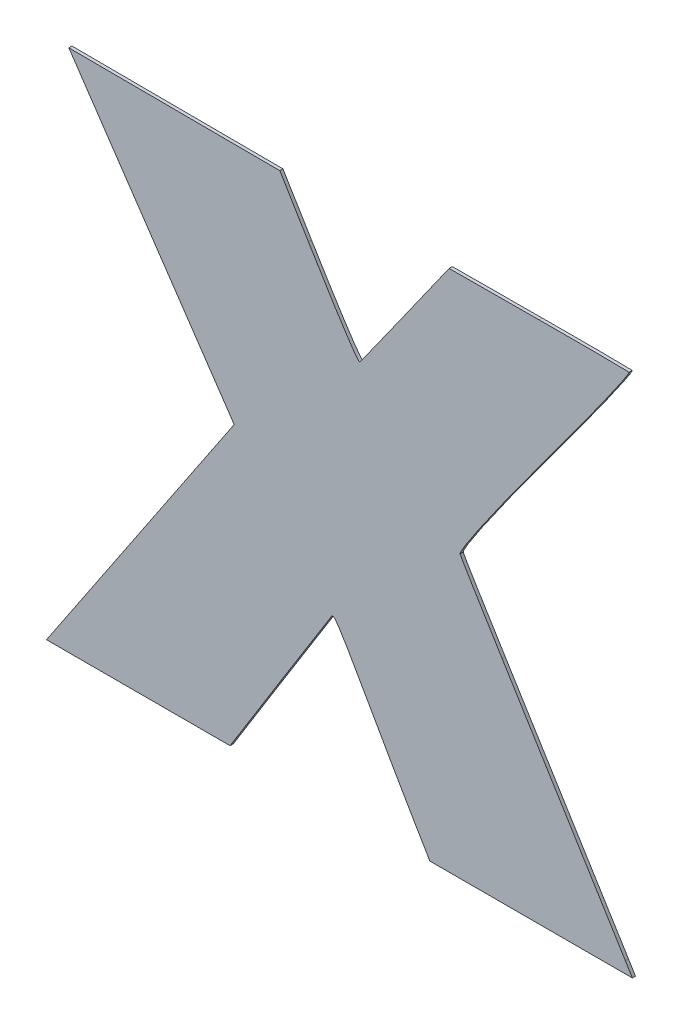
ISO-10303-21;
HEADER;
FILE_DESCRIPTION(('STEP AP214'),'2;1');
FILE_NAME('part.step','',(''),(''),'','','');
FILE_SCHEMA(('AUTOMOTIVE_DESIGN { 1 0 10303 214 1 1 1 1 }'));
ENDSEC;
DATA;
#1=APPLICATION_CONTEXT('core data for automotive mechanical design processes');
#2=APPLICATION_PROTOCOL_DEFINITION('international standard','automotive_design',2000,#1);
#3=PRODUCT_CONTEXT('',#1,'mechanical');
#4=PRODUCT('Part','Part','',(#3));
#5=PRODUCT_RELATED_PRODUCT_CATEGORY('part','',(#4));
#6=PRODUCT_DEFINITION_FORMATION('','',#4);
#7=PRODUCT_DEFINITION_CONTEXT('part definition',#1,'design');
#8=PRODUCT_DEFINITION('design','',#6,#7);
#9=PRODUCT_DEFINITION_SHAPE('','',#8);
#10=(LENGTH_UNIT() NAMED_UNIT(*) SI_UNIT(.MILLI.,.METRE.));
#11=(NAMED_UNIT(*) PLANE_ANGLE_UNIT() SI_UNIT($,.RADIAN.));
#12=(NAMED_UNIT(*) SI_UNIT($,.STERADIAN.) SOLID_ANGLE_UNIT());
#13=UNCERTAINTY_MEASURE_WITH_UNIT(LENGTH_MEASURE(1.E-05),#10,'distance_accuracy_value','');
#14=(GEOMETRIC_REPRESENTATION_CONTEXT(3) GLOBAL_UNCERTAINTY_ASSIGNED_CONTEXT((#13)) GLOBAL_UNIT_ASSIGNED_CONTEXT((#10,
#11,#12)) REPRESENTATION_CONTEXT('',''));
#15=CARTESIAN_POINT('',(0.,0.,0.));
#16=DIRECTION('',(0.,0.,1.));
#17=DIRECTION('',(1.,0.,0.));
#18=AXIS2_PLACEMENT_3D('',#15,#16,#17);
#19=CARTESIAN_POINT('',(1.091122017532,-0.01749305589444,0.002950587767671));
#20=DIRECTION('',(-0.830849751159406,0.556496802325362,0.));
#21=DIRECTION('',(0.,0.,1.));
#22=AXIS2_PLACEMENT_3D('',#19,#20,#21);
#23=PLANE('',#22);
#24=DIRECTION('',(0.,0.,1.));
#25=VECTOR('',#24,1.);
#26=CARTESIAN_POINT('',(1.046031886732,-0.08480498629444,-4.94122323289E-05));
#27=LINE('',#26,#25);
#28=CARTESIAN_POINT('',(1.0460318863354,-0.0848075325334486,-4.94122323289E-05));
#29=VERTEX_POINT('',#28);
#30=CARTESIAN_POINT('',(1.0460318871288,-0.0848075313488238,0.002950587767671));
#31=VERTEX_POINT('',#30);
#32=EDGE_CURVE('E11',#29,#31,#27,.T.);
#33=ORIENTED_EDGE('',*,*,#32,.T.);
#34=DIRECTION('',(0.556496802325362,0.830849751159406,0.));
#35=VECTOR('',#34,1.);
#36=CARTESIAN_POINT('',(1.046031886732,-0.08481262322777,0.002950587767671));
#37=LINE('',#36,#35);
#38=CARTESIAN_POINT('',(1.136212148332,0.04982651143889,0.002950587767671));
#39=VERTEX_POINT('',#38);
#40=EDGE_CURVE('E24',#31,#39,#37,.T.);
#41=ORIENTED_EDGE('',*,*,#40,.T.);
#42=DIRECTION('',(0.,0.,1.));
#43=VECTOR('',#42,1.);
#44=CARTESIAN_POINT('',(1.136212148332,0.04982651143889,-4.94122323289E-05));
#45=LINE('',#44,#43);
#46=CARTESIAN_POINT('',(1.136212148332,0.04982651143889,-4.94122323289E-05));
#47=VERTEX_POINT('',#46);
#48=EDGE_CURVE('E564',#47,#39,#45,.T.);
#49=ORIENTED_EDGE('',*,*,#48,.F.);
#50=DIRECTION('',(0.556496802325362,0.830849751159406,0.));
#51=VECTOR('',#50,1.);
#52=CARTESIAN_POINT('',(1.046031886732,-0.08481262322777,-4.94122323289E-05));
#53=LINE('',#52,#51);
#54=EDGE_CURVE('E562',#29,#47,#53,.T.);
#55=ORIENTED_EDGE('',*,*,#54,.F.);
#56=EDGE_LOOP('',(#33,#41,#49,#55));
#57=FACE_BOUND('',#56,.T.);
#58=ADVANCED_FACE('F17',(#57),#23,.T.);
#59=CARTESIAN_POINT('',(1.110101349088,0.088265003692445,0.002950587767671));
#60=DIRECTION('',(-0.827200339855888,-0.561907107752076,0.));
#61=DIRECTION('',(0.,0.,1.));
#62=AXIS2_PLACEMENT_3D('',#59,#60,#61);
#63=PLANE('',#62);
#64=ORIENTED_EDGE('',*,*,#48,.T.);
#65=DIRECTION('',(-0.561907107752076,0.827200339855888,0.));
#66=VECTOR('',#65,1.);
#67=CARTESIAN_POINT('',(1.136212148332,0.04982651143889,0.002950587767671));
#68=LINE('',#67,#66);
#69=CARTESIAN_POINT('',(1.083990549844,0.126703495946,0.002950587767671));
#70=VERTEX_POINT('',#69);
#71=EDGE_CURVE('E560',#39,#70,#68,.T.);
#72=ORIENTED_EDGE('',*,*,#71,.T.);
#73=DIRECTION('',(0.,0.,1.));
#74=VECTOR('',#73,1.);
#75=CARTESIAN_POINT('',(1.083990549844,0.126703495946,-4.94122323289E-05));
#76=LINE('',#75,#74);
#77=CARTESIAN_POINT('',(1.083990549844,0.126703495946,-4.94122323289E-05));
#78=VERTEX_POINT('',#77);
#79=EDGE_CURVE('E557',#78,#70,#76,.T.);
#80=ORIENTED_EDGE('',*,*,#79,.F.);
#81=DIRECTION('',(-0.561907107752076,0.827200339855888,0.));
#82=VECTOR('',#81,1.);
#83=CARTESIAN_POINT('',(1.136212148332,0.04982651143889,-4.94122323289E-05));
#84=LINE('',#83,#82);
#85=EDGE_CURVE('E551',#47,#78,#84,.T.);
#86=ORIENTED_EDGE('',*,*,#85,.F.);
#87=EDGE_LOOP('',(#64,#72,#80,#86));
#88=FACE_BOUND('',#87,.T.);
#89=ADVANCED_FACE('F570',(#88),#63,.T.);
#90=CARTESIAN_POINT('',(1.083990549844,0.126703495946,0.002950587767671));
#91=CARTESIAN_POINT('',(1.083990549844,0.126703495946,-0.00064941223232888));
#92=CARTESIAN_POINT('',(1.055268726555,0.168985830594,0.002950587767671));
#93=CARTESIAN_POINT('',(1.055268726555,0.168985830594,-0.00064941223232888));
#94=CARTESIAN_POINT('',(1.019514964066,0.221654084132,0.002950587767671));
#95=CARTESIAN_POINT('',(1.019514964066,0.221654084132,-0.00064941223232888));
#96=CARTESIAN_POINT('',(1.004537633932,0.243744044186,0.002950587767671));
#97=CARTESIAN_POINT('',(1.004537633932,0.243744044186,-0.00064941223232888));
#98=B_SPLINE_SURFACE_WITH_KNOTS('',3,1,((#90,#91),(#92,#93),(#94,#95),(#96,#97)),.UNSPECIFIED.,
.F.,.F.,.F.,(4,4),(2,2),(0.,1.),(0.,0.000359999999999988),.UNSPECIFIED.);
#99=CARTESIAN_POINT('',(1.083990549844,0.126703495946,0.002950587767671));
#100=CARTESIAN_POINT('',(1.055268726555,0.168985830594,0.002950587767671));
#101=CARTESIAN_POINT('',(1.019514964066,0.221654084132,0.002950587767671));
#102=CARTESIAN_POINT('',(1.004537633932,0.243744044186,0.002950587767671));
#103=B_SPLINE_CURVE_WITH_KNOTS('',3,(#99,#100,#101,#102),.UNSPECIFIED.,.F.,.F.,(4,4),(0.,1.),.UNSPECIFIED.);
#104=CARTESIAN_POINT('',(1.004537633932,0.243744044186,0.002950587767671));
#105=VERTEX_POINT('',#104);
#106=EDGE_CURVE('E547',#70,#105,#103,.T.);
#107=DIRECTION('',(0.,0.,1.));
#108=VECTOR('',#107,1.);
#109=CARTESIAN_POINT('',(1.004537633932,0.243744044186,-4.94122323289E-05));
#110=LINE('',#109,#108);
#111=CARTESIAN_POINT('',(1.004537633932,0.243744044186,-4.94122323289E-05));
#112=VERTEX_POINT('',#111);
#113=EDGE_CURVE('E541',#112,#105,#110,.T.);
#114=CARTESIAN_POINT('',(1.083990549844,0.126703495946,-4.94122323289E-05));
#115=CARTESIAN_POINT('',(1.055268726555,0.168985830594,-4.94122323289E-05));
#116=CARTESIAN_POINT('',(1.019514964066,0.221654084132,-4.94122323289E-05));
#117=CARTESIAN_POINT('',(1.004537633932,0.243744044186,-4.94122323289E-05));
#118=B_SPLINE_CURVE_WITH_KNOTS('',3,(#114,#115,#116,#117),.UNSPECIFIED.,.F.,.F.,(4,4),(0.,1.),.UNSPECIFIED.);
#119=EDGE_CURVE('E536',#78,#112,#118,.T.);
#120=ORIENTED_EDGE('',*,*,#79,.T.);
#121=ORIENTED_EDGE('',*,*,#106,.T.);
#122=ORIENTED_EDGE('',*,*,#113,.F.);
#123=ORIENTED_EDGE('',*,*,#119,.F.);
#124=EDGE_LOOP('',(#120,#121,#122,#123));
#125=FACE_BOUND('',#124,.T.);
#126=ADVANCED_FACE('F575',(#125),#98,.T.);
#127=CARTESIAN_POINT('',(0.990921975221,0.2638258322615,0.002950587767671));
#128=DIRECTION('',(-0.827691514671756,-0.56118335376272,0.));
#129=DIRECTION('',(0.,0.,1.));
#130=AXIS2_PLACEMENT_3D('',#127,#128,#129);
#131=PLANE('',#130);
#132=ORIENTED_EDGE('',*,*,#113,.T.);
#133=DIRECTION('',(-0.56118335376272,0.827691514671756,0.));
#134=VECTOR('',#133,1.);
#135=CARTESIAN_POINT('',(1.004537633932,0.243744044186,0.002950587767671));
#136=LINE('',#135,#134);
#137=CARTESIAN_POINT('',(0.97730631651,0.283907620337,0.002950587767671));
#138=VERTEX_POINT('',#137);
#139=EDGE_CURVE('E534',#105,#138,#136,.T.);
#140=ORIENTED_EDGE('',*,*,#139,.T.);
#141=DIRECTION('',(0.,0.,1.));
#142=VECTOR('',#141,1.);
#143=CARTESIAN_POINT('',(0.97730631651,0.283907620337,-4.94122323289E-05));
#144=LINE('',#143,#142);
#145=CARTESIAN_POINT('',(0.97730631651,0.283907620337,-4.94122323289E-05));
#146=VERTEX_POINT('',#145);
#147=EDGE_CURVE('E531',#146,#138,#144,.T.);
#148=ORIENTED_EDGE('',*,*,#147,.F.);
#149=DIRECTION('',(-0.56118335376272,0.827691514671756,0.));
#150=VECTOR('',#149,1.);
#151=CARTESIAN_POINT('',(1.004537633932,0.243744044186,-4.94122323289E-05));
#152=LINE('',#151,#150);
#153=EDGE_CURVE('E528',#112,#146,#152,.T.);
#154=ORIENTED_EDGE('',*,*,#153,.F.);
#155=EDGE_LOOP('',(#132,#140,#148,#154));
#156=FACE_BOUND('',#155,.T.);
#157=ADVANCED_FACE('F579',(#156),#131,.T.);
#158=CARTESIAN_POINT('',(1.07868493011,0.2834809330745,0.002950587767671));
#159=DIRECTION('',(0.0042088115840433,0.999991142913301,0.));
#160=DIRECTION('',(0.,0.,1.));
#161=AXIS2_PLACEMENT_3D('',#158,#159,#160);
#162=PLANE('',#161);
#163=ORIENTED_EDGE('',*,*,#147,.T.);
#164=DIRECTION('',(0.999991142913301,-0.0042088115840433,0.));
#165=VECTOR('',#164,1.);
#166=CARTESIAN_POINT('',(0.97730631651,0.283907620337,0.002950587767671));
#167=LINE('',#166,#165);
#168=CARTESIAN_POINT('',(1.18006354371,0.283054245812,0.002950587767671));
#169=VERTEX_POINT('',#168);
#170=EDGE_CURVE('E526',#138,#169,#167,.T.);
#171=ORIENTED_EDGE('',*,*,#170,.T.);
#172=DIRECTION('',(0.,0.,1.));
#173=VECTOR('',#172,1.);
#174=CARTESIAN_POINT('',(1.18006354371,0.283054245812,-4.94122323289E-05));
#175=LINE('',#174,#173);
#176=CARTESIAN_POINT('',(1.18006354371,0.283054245812,-4.94122323289E-05));
#177=VERTEX_POINT('',#176);
#178=EDGE_CURVE('E523',#177,#169,#175,.T.);
#179=ORIENTED_EDGE('',*,*,#178,.F.);
#180=DIRECTION('',(0.999991142913301,-0.0042088115840433,0.));
#181=VECTOR('',#180,1.);
#182=CARTESIAN_POINT('',(0.97730631651,0.283907620337,-4.94122323289E-05));
#183=LINE('',#182,#181);
#184=EDGE_CURVE('E521',#146,#177,#183,.T.);
#185=ORIENTED_EDGE('',*,*,#184,.F.);
#186=EDGE_LOOP('',(#163,#171,#179,#185));
#187=FACE_BOUND('',#186,.T.);
#188=ADVANCED_FACE('F582',(#187),#162,.T.);
#189=CARTESIAN_POINT('',(1.19381672931,0.2602883178165,0.002950587767671));
#190=DIRECTION('',(0.855935996671926,0.517081782314206,0.));
#191=DIRECTION('',(0.,0.,-1.));
#192=AXIS2_PLACEMENT_3D('',#189,#190,#191);
#193=PLANE('',#192);
#194=ORIENTED_EDGE('',*,*,#178,.T.);
#195=DIRECTION('',(0.517081782314206,-0.855935996671926,0.));
#196=VECTOR('',#195,1.);
#197=CARTESIAN_POINT('',(1.18006354371,0.283054245812,0.002950587767671));
#198=LINE('',#197,#196);
#199=CARTESIAN_POINT('',(1.20756991491,0.237522389821,0.002950587767671));
#200=VERTEX_POINT('',#199);
#201=EDGE_CURVE('E511',#169,#200,#198,.T.);
#202=ORIENTED_EDGE('',*,*,#201,.T.);
#203=DIRECTION('',(0.,0.,1.));
#204=VECTOR('',#203,1.);
#205=CARTESIAN_POINT('',(1.20756991491,0.237522389821,-4.94122323289E-05));
#206=LINE('',#205,#204);
#207=CARTESIAN_POINT('',(1.20756991491,0.237522389821,-4.94122323289E-05));
#208=VERTEX_POINT('',#207);
#209=EDGE_CURVE('E507',#208,#200,#206,.T.);
#210=ORIENTED_EDGE('',*,*,#209,.F.);
#211=DIRECTION('',(0.517081782314206,-0.855935996671926,0.));
#212=VECTOR('',#211,1.);
#213=CARTESIAN_POINT('',(1.18006354371,0.283054245812,-4.94122323289E-05));
#214=LINE('',#213,#212);
#215=EDGE_CURVE('E504',#177,#208,#214,.T.);
#216=ORIENTED_EDGE('',*,*,#215,.F.);
#217=EDGE_LOOP('',(#194,#202,#210,#216));
#218=FACE_BOUND('',#217,.T.);
#219=ADVANCED_FACE('F585',(#218),#193,.T.);
#220=CARTESIAN_POINT('',(1.20756991491,0.237522389821,0.002950587767671));
#221=CARTESIAN_POINT('',(1.20756991491,0.237522389821,-0.00064941223232888));
#222=CARTESIAN_POINT('',(1.238174024955,0.186863171297,0.002950587767671));
#223=CARTESIAN_POINT('',(1.238174024955,0.186863171297,-0.00064941223232888));
#224=CARTESIAN_POINT('',(1.255411142288,0.160554618941,0.002950587767671));
#225=CARTESIAN_POINT('',(1.255411142288,0.160554618941,-0.00064941223232888));
#226=CARTESIAN_POINT('',(1.25697454051,0.162118004746,0.002950587767671));
#227=CARTESIAN_POINT('',(1.25697454051,0.162118004746,-0.00064941223232888));
#228=B_SPLINE_SURFACE_WITH_KNOTS('',3,1,((#220,#221),(#222,#223),(#224,#225),(#226,#227)),
.UNSPECIFIED.,.F.,.F.,.F.,(4,4),(2,2),(0.,1.),(0.,0.000359999999999988),.UNSPECIFIED.);
#229=CARTESIAN_POINT('',(1.20756991491,0.237522389821,0.002950587767671));
#230=CARTESIAN_POINT('',(1.238174024955,0.186863171297,0.002950587767671));
#231=CARTESIAN_POINT('',(1.255411142288,0.160554618941,0.002950587767671));
#232=CARTESIAN_POINT('',(1.25697454051,0.162118004746,0.002950587767671));
#233=B_SPLINE_CURVE_WITH_KNOTS('',3,(#229,#230,#231,#232),.UNSPECIFIED.,.F.,.F.,(4,4),(0.,1.),.UNSPECIFIED.);
#234=CARTESIAN_POINT('',(1.25697454051,0.162118004746,0.002950587767671));
#235=VERTEX_POINT('',#234);
#236=EDGE_CURVE('E503',#200,#235,#233,.T.);
#237=CARTESIAN_POINT('',(1.25696379201237,0.162107256716432,-4.94122323286962E-05));
#238=CARTESIAN_POINT('',(1.25696379201237,0.162107256716432,7.55877676712912E-05));
#239=CARTESIAN_POINT('',(1.25696379201237,0.162107256716432,0.000200587767671279));
#240=CARTESIAN_POINT('',(1.25696379201237,0.162107256716432,0.000450587767671253));
#241=CARTESIAN_POINT('',(1.25696379201237,0.162107256716432,0.000575587767671241));
#242=CARTESIAN_POINT('',(1.25696379201237,0.162107256716432,0.000825587767671215));
#243=CARTESIAN_POINT('',(1.25696379201237,0.162107256716432,0.000950587767671202));
#244=CARTESIAN_POINT('',(1.25696379201237,0.162107256716432,0.00120058776767118));
#245=CARTESIAN_POINT('',(1.25696379201237,0.162107256716432,0.00132558776767116));
#246=CARTESIAN_POINT('',(1.25696379201237,0.162107256716432,0.00157558776767114));
#247=CARTESIAN_POINT('',(1.25696379201237,0.162107256716432,0.00170058776767113));
#248=CARTESIAN_POINT('',(1.25696379201237,0.162107256716432,0.0019505877676711));
#249=CARTESIAN_POINT('',(1.25696379201237,0.162107256716432,0.00207558776767109));
#250=CARTESIAN_POINT('',(1.25696379201237,0.162107256716432,0.00232558776767106));
#251=CARTESIAN_POINT('',(1.25696379201237,0.162107256716432,0.00245058776767105));
#252=CARTESIAN_POINT('',(1.25696379201237,0.162107256716432,0.00270058776767103));
#253=CARTESIAN_POINT('',(1.25696379201237,0.162107256716432,0.00282558776767101));
#254=CARTESIAN_POINT('',(1.25696379201237,0.162107256716432,0.002950587767671));
#255=B_SPLINE_CURVE_WITH_KNOTS('',3,(#237,#238,#239,#240,#241,#242,#243,#244,#245,#246,#247,
#248,#249,#250,#251,#252,#253,#254),.UNSPECIFIED.,.F.,.F.,(4,2,2,2,2,2,2,2,4),(0.,
0.000374999999999962,0.000749999999999924,0.00112499999999989,0.00149999999999985,
0.00187499999999981,0.00224999999999977,0.00262499999999973,0.0029999999999997),.UNSPECIFIED.);
#256=CARTESIAN_POINT('',(1.25697454051,0.162118004746,-4.94122323289E-05));
#257=VERTEX_POINT('',#256);
#258=EDGE_CURVE('E501',#257,#235,#255,.T.);
#259=CARTESIAN_POINT('',(1.25697454051,0.162118004746,-4.94122323289002E-05));
#260=CARTESIAN_POINT('',(1.255411142288,0.160554618941,-4.94122323289002E-05));
#261=CARTESIAN_POINT('',(1.238174024955,0.186863171297,-4.94122323289002E-05));
#262=CARTESIAN_POINT('',(1.20756991491,0.237522389821,-4.94122323289002E-05));
#263=B_SPLINE_CURVE_WITH_KNOTS('',3,(#259,#260,#261,#262),.UNSPECIFIED.,.F.,.F.,(4,4),(0.,1.),.UNSPECIFIED.);
#264=EDGE_CURVE('E459',#208,#257,#263,.F.);
#265=ORIENTED_EDGE('',*,*,#209,.T.);
#266=ORIENTED_EDGE('',*,*,#236,.T.);
#267=ORIENTED_EDGE('',*,*,#258,.F.);
#268=ORIENTED_EDGE('',*,*,#264,.F.);
#269=EDGE_LOOP('',(#265,#266,#267,#268));
#270=FACE_BOUND('',#269,.T.);
#271=ADVANCED_FACE('F411',(#270),#228,.T.);
#272=CARTESIAN_POINT('',(1.25697454051,0.162118004746,0.002950587767671));
#273=CARTESIAN_POINT('',(1.25697454051,0.162118004746,-0.00064941223232888));
#274=CARTESIAN_POINT('',(1.257544889044,0.162688328443,0.002950587767671));
#275=CARTESIAN_POINT('',(1.257544889044,0.162688328443,-0.00064941223232888));
#276=CARTESIAN_POINT('',(1.27708351731,0.190132275474,0.002950587767671));
#277=CARTESIAN_POINT('',(1.27708351731,0.190132275474,-0.00064941223232888));
#278=CARTESIAN_POINT('',(1.300393673044,0.223104592337,0.002950587767671));
#279=CARTESIAN_POINT('',(1.300393673044,0.223104592337,-0.00064941223232888));
#280=B_SPLINE_SURFACE_WITH_KNOTS('',3,1,((#272,#273),(#274,#275),(#276,#277),(#278,#279)),
.UNSPECIFIED.,.F.,.F.,.F.,(4,4),(2,2),(0.,1.),(0.,0.000359999999999988),.UNSPECIFIED.);
#281=CARTESIAN_POINT('',(1.25697454051,0.162118004746,0.002950587767671));
#282=CARTESIAN_POINT('',(1.257544889044,0.162688328443,0.002950587767671));
#283=CARTESIAN_POINT('',(1.27708351731,0.190132275474,0.002950587767671));
#284=CARTESIAN_POINT('',(1.300393673044,0.223104592337,0.002950587767671));
#285=B_SPLINE_CURVE_WITH_KNOTS('',3,(#281,#282,#283,#284),.UNSPECIFIED.,.F.,.F.,(4,4),(0.,1.),.UNSPECIFIED.);
#286=CARTESIAN_POINT('',(1.300393673044,0.223104592337,0.002950587767671));
#287=VERTEX_POINT('',#286);
#288=EDGE_CURVE('E444',#235,#287,#285,.T.);
#289=DIRECTION('',(0.,0.,1.));
#290=VECTOR('',#289,1.);
#291=CARTESIAN_POINT('',(1.300393673044,0.223104592337,-4.94122323289E-05));
#292=LINE('',#291,#290);
#293=CARTESIAN_POINT('',(1.300393673044,0.223104592337,-4.94122323289E-05));
#294=VERTEX_POINT('',#293);
#295=EDGE_CURVE('E491',#294,#287,#292,.T.);
#296=CARTESIAN_POINT('',(1.300393673044,0.223104592337,-4.94122323289002E-05));
#297=CARTESIAN_POINT('',(1.27708351731,0.190132275474,-4.94122323289002E-05));
#298=CARTESIAN_POINT('',(1.257544889044,0.162688328443,-4.94122323289002E-05));
#299=CARTESIAN_POINT('',(1.25697454051,0.162118004746,-4.94122323289002E-05));
#300=B_SPLINE_CURVE_WITH_KNOTS('',3,(#296,#297,#298,#299),.UNSPECIFIED.,.F.,.F.,(4,4),(0.,1.),.UNSPECIFIED.);
#301=EDGE_CURVE('E391',#257,#294,#300,.F.);
#302=ORIENTED_EDGE('',*,*,#258,.T.);
#303=ORIENTED_EDGE('',*,*,#288,.T.);
#304=ORIENTED_EDGE('',*,*,#295,.F.);
#305=ORIENTED_EDGE('',*,*,#301,.F.);
#306=EDGE_LOOP('',(#302,#303,#304,#305));
#307=FACE_BOUND('',#306,.T.);
#308=ADVANCED_FACE('F398',(#307),#280,.T.);
#309=CARTESIAN_POINT('',(1.321584797088,0.2530794190745,0.002950587767671));
#310=DIRECTION('',(-0.816551529286003,0.577272552630635,0.));
#311=DIRECTION('',(0.,0.,1.));
#312=AXIS2_PLACEMENT_3D('',#309,#310,#311);
#313=PLANE('',#312);
#314=ORIENTED_EDGE('',*,*,#295,.T.);
#315=DIRECTION('',(0.577272552630635,0.816551529286003,0.));
#316=VECTOR('',#315,1.);
#317=CARTESIAN_POINT('',(1.300393673044,0.223104592337,0.002950587767671));
#318=LINE('',#317,#316);
#319=CARTESIAN_POINT('',(1.342775921132,0.283054245812,0.002950587767671));
#320=VERTEX_POINT('',#319);
#321=EDGE_CURVE('E387',#287,#320,#318,.T.);
#322=ORIENTED_EDGE('',*,*,#321,.T.);
#323=DIRECTION('',(0.,0.,1.));
#324=VECTOR('',#323,1.);
#325=CARTESIAN_POINT('',(1.342775921132,0.283054245812,-4.94122323289E-05));
#326=LINE('',#325,#324);
#327=CARTESIAN_POINT('',(1.342775921132,0.283054245812,-4.94122323289E-05));
#328=VERTEX_POINT('',#327);
#329=EDGE_CURVE('E384',#328,#320,#326,.T.);
#330=ORIENTED_EDGE('',*,*,#329,.F.);
#331=DIRECTION('',(0.577272552630635,0.816551529286003,0.));
#332=VECTOR('',#331,1.);
#333=CARTESIAN_POINT('',(1.300393673044,0.223104592337,-4.94122323289E-05));
#334=LINE('',#333,#332);
#335=EDGE_CURVE('E379',#294,#328,#334,.T.);
#336=ORIENTED_EDGE('',*,*,#335,.F.);
#337=EDGE_LOOP('',(#314,#322,#330,#336));
#338=FACE_BOUND('',#337,.T.);
#339=ADVANCED_FACE('F410',(#338),#313,.T.);
#340=CARTESIAN_POINT('',(1.3859844481545,0.2832685890745,0.002950587767671));
#341=DIRECTION('',(-0.0049606093984792,0.999987696101505,0.));
#342=DIRECTION('',(0.,0.,1.));
#343=AXIS2_PLACEMENT_3D('',#340,#341,#342);
#344=PLANE('',#343);
#345=ORIENTED_EDGE('',*,*,#329,.T.);
#346=DIRECTION('',(0.999987696101505,0.0049606093984792,0.));
#347=VECTOR('',#346,1.);
#348=CARTESIAN_POINT('',(1.342775921132,0.283054245812,0.002950587767671));
#349=LINE('',#348,#347);
#350=CARTESIAN_POINT('',(1.429192975177,0.283482932337,0.002950587767671));
#351=VERTEX_POINT('',#350);
#352=EDGE_CURVE('E377',#320,#351,#349,.T.);
#353=ORIENTED_EDGE('',*,*,#352,.T.);
#354=DIRECTION('',(0.,0.,1.));
#355=VECTOR('',#354,1.);
#356=CARTESIAN_POINT('',(1.429192975177,0.283482932337,-4.94122323289E-05));
#357=LINE('',#356,#355);
#358=CARTESIAN_POINT('',(1.429192975177,0.283482932337,-4.94122323289E-05));
#359=VERTEX_POINT('',#358);
#360=EDGE_CURVE('E374',#359,#351,#357,.T.);
#361=ORIENTED_EDGE('',*,*,#360,.F.);
#362=DIRECTION('',(0.999987696101505,0.0049606093984792,0.));
#363=VECTOR('',#362,1.);
#364=CARTESIAN_POINT('',(1.342775921132,0.283054245812,-4.94122323289E-05));
#365=LINE('',#364,#363);
#366=EDGE_CURVE('E368',#328,#359,#365,.T.);
#367=ORIENTED_EDGE('',*,*,#366,.F.);
#368=EDGE_LOOP('',(#345,#353,#361,#367));
#369=FACE_BOUND('',#368,.T.);
#370=ADVANCED_FACE('F607',(#369),#344,.T.);
#371=CARTESIAN_POINT('',(1.429192975177,0.283482932337,0.002950587767671));
#372=CARTESIAN_POINT('',(1.429192975177,0.283482932337,-0.00064941223232888));
#373=CARTESIAN_POINT('',(1.476722516332,0.283718721101,0.002950587767671));
#374=CARTESIAN_POINT('',(1.476722516332,0.283718721101,-0.00064941223232888));
#375=CARTESIAN_POINT('',(1.515610153399,0.283499447981,0.002950587767671));
#376=CARTESIAN_POINT('',(1.515610153399,0.283499447981,-0.00064941223232888));
#377=CARTESIAN_POINT('',(1.515610153399,0.28299424311,0.002950587767671));
#378=CARTESIAN_POINT('',(1.515610153399,0.28299424311,-0.00064941223232888));
#379=B_SPLINE_SURFACE_WITH_KNOTS('',3,1,((#371,#372),(#373,#374),(#375,#376),(#377,#378)),
.UNSPECIFIED.,.F.,.F.,.F.,(4,4),(2,2),(0.,1.),(0.,0.000359999999999988),.UNSPECIFIED.);
#380=CARTESIAN_POINT('',(1.429192975177,0.283482932337,0.002950587767671));
#381=CARTESIAN_POINT('',(1.476722516332,0.283718721101,0.002950587767671));
#382=CARTESIAN_POINT('',(1.515610153399,0.283499447981,0.002950587767671));
#383=CARTESIAN_POINT('',(1.515610153399,0.28299424311,0.002950587767671));
#384=B_SPLINE_CURVE_WITH_KNOTS('',3,(#380,#381,#382,#383),.UNSPECIFIED.,.F.,.F.,(4,4),(0.,1.),.UNSPECIFIED.);
#385=CARTESIAN_POINT('',(1.515610153399,0.28299424311,0.002950587767671));
#386=VERTEX_POINT('',#385);
#387=EDGE_CURVE('E364',#351,#386,#384,.T.);
#388=DIRECTION('',(0.,0.,1.));
#389=VECTOR('',#388,1.);
#390=CARTESIAN_POINT('',(1.515610153399,0.28299424311,-4.94122323289E-05));
#391=LINE('',#390,#389);
#392=CARTESIAN_POINT('',(1.515610153399,0.28299424311,-4.94122323289E-05));
#393=VERTEX_POINT('',#392);
#394=EDGE_CURVE('E358',#393,#386,#391,.T.);
#395=CARTESIAN_POINT('',(1.429192975177,0.283482932337,-4.94122323289E-05));
#396=CARTESIAN_POINT('',(1.476722516332,0.283718721101,-4.94122323289E-05));
#397=CARTESIAN_POINT('',(1.515610153399,0.283499447981,-4.94122323289E-05));
#398=CARTESIAN_POINT('',(1.515610153399,0.28299424311,-4.94122323289E-05));
#399=B_SPLINE_CURVE_WITH_KNOTS('',3,(#395,#396,#397,#398),.UNSPECIFIED.,.F.,.F.,(4,4),(0.,1.),.UNSPECIFIED.);
#400=EDGE_CURVE('E350',#359,#393,#399,.T.);
#401=ORIENTED_EDGE('',*,*,#360,.T.);
#402=ORIENTED_EDGE('',*,*,#387,.T.);
#403=ORIENTED_EDGE('',*,*,#394,.F.);
#404=ORIENTED_EDGE('',*,*,#400,.F.);
#405=EDGE_LOOP('',(#401,#402,#403,#404));
#406=FACE_BOUND('',#405,.T.);
#407=ADVANCED_FACE('F611',(#406),#379,.T.);
#408=CARTESIAN_POINT('',(1.515610153399,0.28299424311,0.002950587767671));
#409=CARTESIAN_POINT('',(1.515610153399,0.28299424311,-0.00064941223232888));
#410=CARTESIAN_POINT('',(1.515610153399,0.280221800372,0.002950587767671));
#411=CARTESIAN_POINT('',(1.515610153399,0.280221800372,-0.00064941223232888));
#412=CARTESIAN_POINT('',(1.480798279355,0.23094548767,0.002950587767671));
#413=CARTESIAN_POINT('',(1.480798279355,0.23094548767,-0.00064941223232888));
#414=CARTESIAN_POINT('',(1.437868034732,0.172949945377,0.002950587767671));
#415=CARTESIAN_POINT('',(1.437868034732,0.172949945377,-0.00064941223232888));
#416=B_SPLINE_SURFACE_WITH_KNOTS('',3,1,((#408,#409),(#410,#411),(#412,#413),(#414,#415)),
.UNSPECIFIED.,.F.,.F.,.F.,(4,4),(2,2),(0.,1.),(0.,0.000359999999999988),.UNSPECIFIED.);
#417=CARTESIAN_POINT('',(1.515610153399,0.28299424311,0.002950587767671));
#418=CARTESIAN_POINT('',(1.515610153399,0.280221800372,0.002950587767671));
#419=CARTESIAN_POINT('',(1.480798279355,0.23094548767,0.002950587767671));
#420=CARTESIAN_POINT('',(1.437868034732,0.172949945377,0.002950587767671));
#421=B_SPLINE_CURVE_WITH_KNOTS('',3,(#417,#418,#419,#420),.UNSPECIFIED.,.F.,.F.,(4,4),(0.,1.),.UNSPECIFIED.);
#422=CARTESIAN_POINT('',(1.437868034732,0.172949945377,0.002950587767671));
#423=VERTEX_POINT('',#422);
#424=EDGE_CURVE('E346',#386,#423,#421,.T.);
#425=DIRECTION('',(0.,0.,1.));
#426=VECTOR('',#425,1.);
#427=CARTESIAN_POINT('',(1.437868034732,0.172949945377,-4.94122323289E-05));
#428=LINE('',#427,#426);
#429=CARTESIAN_POINT('',(1.437868034732,0.172949945377,-4.94122323289E-05));
#430=VERTEX_POINT('',#429);
#431=EDGE_CURVE('E340',#430,#423,#428,.T.);
#432=CARTESIAN_POINT('',(1.515610153399,0.28299424311,-4.94122323289E-05));
#433=CARTESIAN_POINT('',(1.515610153399,0.280221800372,-4.94122323289E-05));
#434=CARTESIAN_POINT('',(1.480798279355,0.23094548767,-4.94122323289E-05));
#435=CARTESIAN_POINT('',(1.437868034732,0.172949945377,-4.94122323289E-05));
#436=B_SPLINE_CURVE_WITH_KNOTS('',3,(#432,#433,#434,#435),.UNSPECIFIED.,.F.,.F.,(4,4),(0.,1.),.UNSPECIFIED.);
#437=EDGE_CURVE('E332',#393,#430,#436,.T.);
#438=ORIENTED_EDGE('',*,*,#394,.T.);
#439=ORIENTED_EDGE('',*,*,#424,.T.);
#440=ORIENTED_EDGE('',*,*,#431,.F.);
#441=ORIENTED_EDGE('',*,*,#437,.F.);
#442=EDGE_LOOP('',(#438,#439,#440,#441));
#443=FACE_BOUND('',#442,.T.);
#444=ADVANCED_FACE('F614',(#443),#416,.T.);
#445=CARTESIAN_POINT('',(1.437868034732,0.172949945377,0.002950587767671));
#446=CARTESIAN_POINT('',(1.437868034732,0.172949945377,-0.00064941223232888));
#447=CARTESIAN_POINT('',(1.388584730821,0.106371855972,0.002950587767671));
#448=CARTESIAN_POINT('',(1.388584730821,0.106371855972,-0.00064941223232888));
#449=CARTESIAN_POINT('',(1.353351149044,0.05542756252334,0.002950587767671));
#450=CARTESIAN_POINT('',(1.353351149044,0.05542756252334,-0.00064941223232888));
#451=CARTESIAN_POINT('',(1.353351149044,0.05074661910112,0.002950587767671));
#452=CARTESIAN_POINT('',(1.353351149044,0.05074661910112,-0.00064941223232888));
#453=B_SPLINE_SURFACE_WITH_KNOTS('',3,1,((#445,#446),(#447,#448),(#449,#450),(#451,#452)),
.UNSPECIFIED.,.F.,.F.,.F.,(4,4),(2,2),(0.,1.),(0.,0.000359999999999988),.UNSPECIFIED.);
#454=CARTESIAN_POINT('',(1.437868034732,0.172949945377,0.002950587767671));
#455=CARTESIAN_POINT('',(1.388584730821,0.106371855972,0.002950587767671));
#456=CARTESIAN_POINT('',(1.353351149044,0.05542756252334,0.002950587767671));
#457=CARTESIAN_POINT('',(1.353351149044,0.05074661910112,0.002950587767671));
#458=B_SPLINE_CURVE_WITH_KNOTS('',3,(#454,#455,#456,#457),.UNSPECIFIED.,.F.,.F.,(4,4),(0.,1.),.UNSPECIFIED.);
#459=CARTESIAN_POINT('',(1.353351149044,0.05074661910112,0.002950587767671));
#460=VERTEX_POINT('',#459);
#461=EDGE_CURVE('E328',#423,#460,#458,.T.);
#462=DIRECTION('',(0.,0.,1.));
#463=VECTOR('',#462,1.);
#464=CARTESIAN_POINT('',(1.353351149044,0.05074661910112,-4.94122323289E-05));
#465=LINE('',#464,#463);
#466=CARTESIAN_POINT('',(1.353351149044,0.05074661910112,-4.94122323289E-05));
#467=VERTEX_POINT('',#466);
#468=EDGE_CURVE('E322',#467,#460,#465,.T.);
#469=CARTESIAN_POINT('',(1.437868034732,0.172949945377,-4.94122323289E-05));
#470=CARTESIAN_POINT('',(1.388584730821,0.106371855972,-4.94122323289E-05));
#471=CARTESIAN_POINT('',(1.353351149044,0.05542756252334,-4.94122323289E-05));
#472=CARTESIAN_POINT('',(1.353351149044,0.05074661910112,-4.94122323289E-05));
#473=B_SPLINE_CURVE_WITH_KNOTS('',3,(#469,#470,#471,#472),.UNSPECIFIED.,.F.,.F.,(4,4),(0.,1.),.UNSPECIFIED.);
#474=EDGE_CURVE('E314',#430,#467,#473,.T.);
#475=ORIENTED_EDGE('',*,*,#431,.T.);
#476=ORIENTED_EDGE('',*,*,#461,.T.);
#477=ORIENTED_EDGE('',*,*,#468,.F.);
#478=ORIENTED_EDGE('',*,*,#474,.F.);
#479=EDGE_LOOP('',(#475,#476,#477,#478));
#480=FACE_BOUND('',#479,.T.);
#481=ADVANCED_FACE('F619',(#480),#453,.T.);
#482=CARTESIAN_POINT('',(1.353351149044,0.05074661910112,0.002950587767671));
#483=CARTESIAN_POINT('',(1.353351149044,0.05074661910112,-0.00064941223232888));
#484=CARTESIAN_POINT('',(1.353351149044,0.04973968633667,0.002950587767671));
#485=CARTESIAN_POINT('',(1.353351149044,0.04973968633667,-0.00064941223232888));
#486=CARTESIAN_POINT('',(1.371483091444,0.01963963872778,0.002950587767671));
#487=CARTESIAN_POINT('',(1.371483091444,0.01963963872778,-0.00064941223232888));
#488=CARTESIAN_POINT('',(1.393644354377,-0.01614237420555,0.002950587767671));
#489=CARTESIAN_POINT('',(1.393644354377,-0.01614237420555,-0.00064941223232888));
#490=B_SPLINE_SURFACE_WITH_KNOTS('',3,1,((#482,#483),(#484,#485),(#486,#487),(#488,#489)),
.UNSPECIFIED.,.F.,.F.,.F.,(4,4),(2,2),(0.,1.),(0.,0.000359999999999988),.UNSPECIFIED.);
#491=CARTESIAN_POINT('',(1.353351149044,0.05074661910112,0.002950587767671));
#492=CARTESIAN_POINT('',(1.353351149044,0.04973968633667,0.002950587767671));
#493=CARTESIAN_POINT('',(1.371483091444,0.01963963872778,0.002950587767671));
#494=CARTESIAN_POINT('',(1.393644354377,-0.01614237420555,0.002950587767671));
#495=B_SPLINE_CURVE_WITH_KNOTS('',3,(#491,#492,#493,#494),.UNSPECIFIED.,.F.,.F.,(4,4),(0.,1.),.UNSPECIFIED.);
#496=CARTESIAN_POINT('',(1.393644354377,-0.01614237420555,0.002950587767671));
#497=VERTEX_POINT('',#496);
#498=EDGE_CURVE('E310',#460,#497,#495,.T.);
#499=DIRECTION('',(0.,0.,1.));
#500=VECTOR('',#499,1.);
#501=CARTESIAN_POINT('',(1.393644354377,-0.01614237420555,-4.94122323289E-05));
#502=LINE('',#501,#500);
#503=CARTESIAN_POINT('',(1.393644354377,-0.01614237420555,-4.94122323289E-05));
#504=VERTEX_POINT('',#503);
#505=EDGE_CURVE('E304',#504,#497,#502,.T.);
#506=CARTESIAN_POINT('',(1.353351149044,0.05074661910112,-4.94122323289E-05));
#507=CARTESIAN_POINT('',(1.353351149044,0.04973968633667,-4.94122323289E-05));
#508=CARTESIAN_POINT('',(1.371483091444,0.01963963872778,-4.94122323289E-05));
#509=CARTESIAN_POINT('',(1.393644354377,-0.01614237420555,-4.94122323289E-05));
#510=B_SPLINE_CURVE_WITH_KNOTS('',3,(#506,#507,#508,#509),.UNSPECIFIED.,.F.,.F.,(4,4),(0.,1.),.UNSPECIFIED.);
#511=EDGE_CURVE('E296',#467,#504,#510,.T.);
#512=ORIENTED_EDGE('',*,*,#468,.T.);
#513=ORIENTED_EDGE('',*,*,#498,.T.);
#514=ORIENTED_EDGE('',*,*,#505,.F.);
#515=ORIENTED_EDGE('',*,*,#511,.F.);
#516=EDGE_LOOP('',(#512,#513,#514,#515));
#517=FACE_BOUND('',#516,.T.);
#518=ADVANCED_FACE('F623',(#517),#490,.T.);
#519=CARTESIAN_POINT('',(1.393644354377,-0.01614237420555,0.002950587767671));
#520=CARTESIAN_POINT('',(1.393644354377,-0.01614237420555,-0.00064941223232888));
#521=CARTESIAN_POINT('',(1.42769464611,-0.07112052067666,0.002950587767671));
#522=CARTESIAN_POINT('',(1.42769464611,-0.07112052067666,-0.00064941223232888));
#523=CARTESIAN_POINT('',(1.48710737971,-0.167531973494,0.002950587767671));
#524=CARTESIAN_POINT('',(1.48710737971,-0.167531973494,-0.00064941223232888));
#525=CARTESIAN_POINT('',(1.512095053044,-0.208356908072,0.002950587767671));
#526=CARTESIAN_POINT('',(1.512095053044,-0.208356908072,-0.00064941223232888));
#527=B_SPLINE_SURFACE_WITH_KNOTS('',3,1,((#519,#520),(#521,#522),(#523,#524),(#525,#526)),
.UNSPECIFIED.,.F.,.F.,.F.,(4,4),(2,2),(0.,1.),(0.,0.000359999999999988),.UNSPECIFIED.);
#528=CARTESIAN_POINT('',(1.393644354377,-0.01614237420555,0.002950587767671));
#529=CARTESIAN_POINT('',(1.42769464611,-0.07112052067666,0.002950587767671));
#530=CARTESIAN_POINT('',(1.48710737971,-0.167531973494,0.002950587767671));
#531=CARTESIAN_POINT('',(1.512095053044,-0.208356908072,0.002950587767671));
#532=B_SPLINE_CURVE_WITH_KNOTS('',3,(#528,#529,#530,#531),.UNSPECIFIED.,.F.,.F.,(4,4),(0.,1.),.UNSPECIFIED.);
#533=CARTESIAN_POINT('',(1.512095053044,-0.208356908072,0.002950587767671));
#534=VERTEX_POINT('',#533);
#535=EDGE_CURVE('E292',#497,#534,#532,.T.);
#536=DIRECTION('',(0.,0.,1.));
#537=VECTOR('',#536,1.);
#538=CARTESIAN_POINT('',(1.512095053044,-0.208356908072,-4.94122323289E-05));
#539=LINE('',#538,#537);
#540=CARTESIAN_POINT('',(1.512095053044,-0.208356908072,-4.94122323289E-05));
#541=VERTEX_POINT('',#540);
#542=EDGE_CURVE('E286',#541,#534,#539,.T.);
#543=CARTESIAN_POINT('',(1.393644354377,-0.01614237420555,-4.94122323289E-05));
#544=CARTESIAN_POINT('',(1.42769464611,-0.07112052067666,-4.94122323289E-05));
#545=CARTESIAN_POINT('',(1.48710737971,-0.167531973494,-4.94122323289E-05));
#546=CARTESIAN_POINT('',(1.512095053044,-0.208356908072,-4.94122323289E-05));
#547=B_SPLINE_CURVE_WITH_KNOTS('',3,(#543,#544,#545,#546),.UNSPECIFIED.,.F.,.F.,(4,4),(0.,1.),.UNSPECIFIED.);
#548=EDGE_CURVE('E281',#504,#541,#547,.T.);
#549=ORIENTED_EDGE('',*,*,#505,.T.);
#550=ORIENTED_EDGE('',*,*,#535,.T.);
#551=ORIENTED_EDGE('',*,*,#542,.F.);
#552=ORIENTED_EDGE('',*,*,#548,.F.);
#553=EDGE_LOOP('',(#549,#550,#551,#552));
#554=FACE_BOUND('',#553,.T.);
#555=ADVANCED_FACE('F627',(#554),#527,.T.);
#556=CARTESIAN_POINT('',(1.5154904460215,-0.2139043640275,0.002950587767671));
#557=DIRECTION('',(0.85292035515963,0.522041059452578,0.));
#558=DIRECTION('',(0.,0.,-1.));
#559=AXIS2_PLACEMENT_3D('',#556,#557,#558);
#560=PLANE('',#559);
#561=ORIENTED_EDGE('',*,*,#542,.T.);
#562=DIRECTION('',(0.522041059452578,-0.85292035515963,0.));
#563=VECTOR('',#562,1.);
#564=CARTESIAN_POINT('',(1.512095053044,-0.208356908072,0.002950587767671));
#565=LINE('',#564,#563);
#566=CARTESIAN_POINT('',(1.518885838999,-0.219451819983,0.002950587767671));
#567=VERTEX_POINT('',#566);
#568=EDGE_CURVE('E279',#534,#567,#565,.T.);
#569=ORIENTED_EDGE('',*,*,#568,.T.);
#570=DIRECTION('',(0.,0.,1.));
#571=VECTOR('',#570,1.);
#572=CARTESIAN_POINT('',(1.518885838999,-0.219451819983,-4.94122323289E-05));
#573=LINE('',#572,#571);
#574=CARTESIAN_POINT('',(1.518885838999,-0.219451819983,-4.94122323289E-05));
#575=VERTEX_POINT('',#574);
#576=EDGE_CURVE('E276',#575,#567,#573,.T.);
#577=ORIENTED_EDGE('',*,*,#576,.F.);
#578=DIRECTION('',(0.522041059452578,-0.85292035515963,0.));
#579=VECTOR('',#578,1.);
#580=CARTESIAN_POINT('',(1.512095053044,-0.208356908072,-4.94122323289E-05));
#581=LINE('',#580,#579);
#582=EDGE_CURVE('E273',#541,#575,#581,.T.);
#583=ORIENTED_EDGE('',*,*,#582,.F.);
#584=EDGE_LOOP('',(#561,#569,#577,#583));
#585=FACE_BOUND('',#584,.T.);
#586=ADVANCED_FACE('F630',(#585),#560,.T.);
#587=CARTESIAN_POINT('',(1.421573737177,-0.219451819983,0.002950587767671));
#588=DIRECTION('',(0.,-1.,0.));
#589=DIRECTION('',(0.,0.,-1.));
#590=AXIS2_PLACEMENT_3D('',#587,#588,#589);
#591=PLANE('',#590);
#592=ORIENTED_EDGE('',*,*,#576,.T.);
#593=DIRECTION('',(-1.,0.,0.));
#594=VECTOR('',#593,1.);
#595=CARTESIAN_POINT('',(1.518885838999,-0.219451819983,0.002950587767671));
#596=LINE('',#595,#594);
#597=CARTESIAN_POINT('',(1.324261635355,-0.219451819983,0.002950587767671));
#598=VERTEX_POINT('',#597);
#599=EDGE_CURVE('E271',#567,#598,#596,.T.);
#600=ORIENTED_EDGE('',*,*,#599,.T.);
#601=DIRECTION('',(0.,0.,1.));
#602=VECTOR('',#601,1.);
#603=CARTESIAN_POINT('',(1.324261635355,-0.219451819983,-4.94122323289E-05));
#604=LINE('',#603,#602);
#605=CARTESIAN_POINT('',(1.324261635355,-0.219451819983,-4.94122323289E-05));
#606=VERTEX_POINT('',#605);
#607=EDGE_CURVE('E268',#606,#598,#604,.T.);
#608=ORIENTED_EDGE('',*,*,#607,.F.);
#609=DIRECTION('',(-1.,0.,0.));
#610=VECTOR('',#609,1.);
#611=CARTESIAN_POINT('',(1.518885838999,-0.219451819983,-4.94122323289E-05));
#612=LINE('',#611,#610);
#613=EDGE_CURVE('E265',#575,#606,#612,.T.);
#614=ORIENTED_EDGE('',*,*,#613,.F.);
#615=EDGE_LOOP('',(#592,#600,#608,#614));
#616=FACE_BOUND('',#615,.T.);
#617=ADVANCED_FACE('F635',(#616),#591,.T.);
#618=CARTESIAN_POINT('',(1.3163135745995,-0.2059992066945,0.002950587767671));
#619=DIRECTION('',(-0.860960463641766,-0.50867187856786,0.));
#620=DIRECTION('',(0.,0.,1.));
#621=AXIS2_PLACEMENT_3D('',#618,#619,#620);
#622=PLANE('',#621);
#623=ORIENTED_EDGE('',*,*,#607,.T.);
#624=DIRECTION('',(-0.50867187856786,0.860960463641766,0.));
#625=VECTOR('',#624,1.);
#626=CARTESIAN_POINT('',(1.324261635355,-0.219451819983,0.002950587767671));
#627=LINE('',#626,#625);
#628=CARTESIAN_POINT('',(1.308365513844,-0.192546593406,0.002950587767671));
#629=VERTEX_POINT('',#628);
#630=EDGE_CURVE('E263',#598,#629,#627,.T.);
#631=ORIENTED_EDGE('',*,*,#630,.T.);
#632=DIRECTION('',(0.,0.,1.));
#633=VECTOR('',#632,1.);
#634=CARTESIAN_POINT('',(1.308365513844,-0.192546593406,-4.94122323289E-05));
#635=LINE('',#634,#633);
#636=CARTESIAN_POINT('',(1.308365513844,-0.192546593406,-4.94122323289E-05));
#637=VERTEX_POINT('',#636);
#638=EDGE_CURVE('E260',#637,#629,#635,.T.);
#639=ORIENTED_EDGE('',*,*,#638,.F.);
#640=DIRECTION('',(-0.50867187856786,0.860960463641766,0.));
#641=VECTOR('',#640,1.);
#642=CARTESIAN_POINT('',(1.324261635355,-0.219451819983,-4.94122323289E-05));
#643=LINE('',#642,#641);
#644=EDGE_CURVE('E254',#606,#637,#643,.T.);
#645=ORIENTED_EDGE('',*,*,#644,.F.);
#646=EDGE_LOOP('',(#623,#631,#639,#645));
#647=FACE_BOUND('',#646,.T.);
#648=ADVANCED_FACE('F639',(#647),#622,.T.);
#649=CARTESIAN_POINT('',(1.308365513844,-0.192546593406,0.002950587767671));
#650=CARTESIAN_POINT('',(1.308365513844,-0.192546593406,-0.00064941223232888));
#651=CARTESIAN_POINT('',(1.299622777399,-0.177748700161,0.002950587767671));
#652=CARTESIAN_POINT('',(1.299622777399,-0.177748700161,-0.00064941223232888));
#653=CARTESIAN_POINT('',(1.282617996688,-0.148132300161,0.002950587767671));
#654=CARTESIAN_POINT('',(1.282617996688,-0.148132300161,-0.00064941223232888));
#655=CARTESIAN_POINT('',(1.270577470999,-0.126732371183,0.002950587767671));
#656=CARTESIAN_POINT('',(1.270577470999,-0.126732371183,-0.00064941223232888));
#657=B_SPLINE_SURFACE_WITH_KNOTS('',3,1,((#649,#650),(#651,#652),(#653,#654),(#655,#656)),
.UNSPECIFIED.,.F.,.F.,.F.,(4,4),(2,2),(0.,1.),(0.,0.000359999999999988),.UNSPECIFIED.);
#658=CARTESIAN_POINT('',(1.308365513844,-0.192546593406,0.002950587767671));
#659=CARTESIAN_POINT('',(1.299622777399,-0.177748700161,0.002950587767671));
#660=CARTESIAN_POINT('',(1.282617996688,-0.148132300161,0.002950587767671));
#661=CARTESIAN_POINT('',(1.270577470999,-0.126732371183,0.002950587767671));
#662=B_SPLINE_CURVE_WITH_KNOTS('',3,(#658,#659,#660,#661),.UNSPECIFIED.,.F.,.F.,(4,4),(0.,1.),.UNSPECIFIED.);
#663=CARTESIAN_POINT('',(1.270577470999,-0.126732371183,0.002950587767671));
#664=VERTEX_POINT('',#663);
#665=EDGE_CURVE('E250',#629,#664,#662,.T.);
#666=DIRECTION('',(0.,0.,1.));
#667=VECTOR('',#666,1.);
#668=CARTESIAN_POINT('',(1.270577470999,-0.126732371183,-4.94122323289E-05));
#669=LINE('',#668,#667);
#670=CARTESIAN_POINT('',(1.270577470999,-0.126732371183,-4.94122323289E-05));
#671=VERTEX_POINT('',#670);
#672=EDGE_CURVE('E244',#671,#664,#669,.T.);
#673=CARTESIAN_POINT('',(1.308365513844,-0.192546593406,-4.94122323289E-05));
#674=CARTESIAN_POINT('',(1.299622777399,-0.177748700161,-4.94122323289E-05));
#675=CARTESIAN_POINT('',(1.282617996688,-0.148132300161,-4.94122323289E-05));
#676=CARTESIAN_POINT('',(1.270577470999,-0.126732371183,-4.94122323289E-05));
#677=B_SPLINE_CURVE_WITH_KNOTS('',3,(#673,#674,#675,#676),.UNSPECIFIED.,.F.,.F.,(4,4),(0.,1.),.UNSPECIFIED.);
#678=EDGE_CURVE('E236',#637,#671,#677,.T.);
#679=ORIENTED_EDGE('',*,*,#638,.T.);
#680=ORIENTED_EDGE('',*,*,#665,.T.);
#681=ORIENTED_EDGE('',*,*,#672,.F.);
#682=ORIENTED_EDGE('',*,*,#678,.F.);
#683=EDGE_LOOP('',(#679,#680,#681,#682));
#684=FACE_BOUND('',#683,.T.);
#685=ADVANCED_FACE('F643',(#684),#657,.T.);
#686=CARTESIAN_POINT('',(1.270577470999,-0.126732371183,0.002950587767671));
#687=CARTESIAN_POINT('',(1.270577470999,-0.126732371183,-0.00064941223232888));
#688=CARTESIAN_POINT('',(1.237073313132,-0.06718507854333,0.002950587767671));
#689=CARTESIAN_POINT('',(1.237073313132,-0.06718507854333,-0.00064941223232888));
#690=CARTESIAN_POINT('',(1.232250372421,-0.05963184103222,0.002950587767671));
#691=CARTESIAN_POINT('',(1.232250372421,-0.05963184103222,-0.00064941223232888));
#692=CARTESIAN_POINT('',(1.229838839977,-0.06292995313888,0.002950587767671));
#693=CARTESIAN_POINT('',(1.229838839977,-0.06292995313888,-0.00064941223232888));
#694=B_SPLINE_SURFACE_WITH_KNOTS('',3,1,((#686,#687),(#688,#689),(#690,#691),(#692,#693)),
.UNSPECIFIED.,.F.,.F.,.F.,(4,4),(2,2),(0.,1.),(0.,0.000359999999999988),.UNSPECIFIED.);
#695=CARTESIAN_POINT('',(1.270577470999,-0.126732371183,0.002950587767671));
#696=CARTESIAN_POINT('',(1.237073313132,-0.06718507854333,0.002950587767671));
#697=CARTESIAN_POINT('',(1.232250372421,-0.05963184103222,0.002950587767671));
#698=CARTESIAN_POINT('',(1.229838839977,-0.06292995313888,0.002950587767671));
#699=B_SPLINE_CURVE_WITH_KNOTS('',3,(#695,#696,#697,#698),.UNSPECIFIED.,.F.,.F.,(4,4),(0.,1.),.UNSPECIFIED.);
#700=CARTESIAN_POINT('',(1.229838839977,-0.06292995313888,0.002950587767671));
#701=VERTEX_POINT('',#700);
#702=EDGE_CURVE('E232',#664,#701,#699,.T.);
#703=DIRECTION('',(0.,0.,1.));
#704=VECTOR('',#703,1.);
#705=CARTESIAN_POINT('',(1.229838839977,-0.06292995313888,-4.94122323289E-05));
#706=LINE('',#705,#704);
#707=CARTESIAN_POINT('',(1.229838839977,-0.06292995313888,-4.94122323289E-05));
#708=VERTEX_POINT('',#707);
#709=EDGE_CURVE('E226',#708,#701,#706,.T.);
#710=CARTESIAN_POINT('',(1.270577470999,-0.126732371183,-4.94122323289E-05));
#711=CARTESIAN_POINT('',(1.237073313132,-0.06718507854333,-4.94122323289E-05));
#712=CARTESIAN_POINT('',(1.232250372421,-0.05963184103222,-4.94122323289E-05));
#713=CARTESIAN_POINT('',(1.229838839977,-0.06292995313888,-4.94122323289E-05));
#714=B_SPLINE_CURVE_WITH_KNOTS('',3,(#710,#711,#712,#713),.UNSPECIFIED.,.F.,.F.,(4,4),(0.,1.),.UNSPECIFIED.);
#715=EDGE_CURVE('E218',#671,#708,#714,.T.);
#716=ORIENTED_EDGE('',*,*,#672,.T.);
#717=ORIENTED_EDGE('',*,*,#702,.T.);
#718=ORIENTED_EDGE('',*,*,#709,.F.);
#719=ORIENTED_EDGE('',*,*,#715,.F.);
#720=EDGE_LOOP('',(#716,#717,#718,#719));
#721=FACE_BOUND('',#720,.T.);
#722=ADVANCED_FACE('F646',(#721),#694,.T.);
#723=CARTESIAN_POINT('',(1.229838839977,-0.06292995313888,0.002950587767671));
#724=CARTESIAN_POINT('',(1.229838839977,-0.06292995313888,-0.00064941223232888));
#725=CARTESIAN_POINT('',(1.22873614131,-0.06443789356555,0.002950587767671));
#726=CARTESIAN_POINT('',(1.22873614131,-0.06443789356555,-0.00064941223232888));
#727=CARTESIAN_POINT('',(1.206342293399,-0.100270484108,0.002950587767671));
#728=CARTESIAN_POINT('',(1.206342293399,-0.100270484108,-0.00064941223232888));
#729=CARTESIAN_POINT('',(1.180074347177,-0.142557910046,0.002950587767671));
#730=CARTESIAN_POINT('',(1.180074347177,-0.142557910046,-0.00064941223232888));
#731=B_SPLINE_SURFACE_WITH_KNOTS('',3,1,((#723,#724),(#725,#726),(#727,#728),(#729,#730)),
.UNSPECIFIED.,.F.,.F.,.F.,(4,4),(2,2),(0.,1.),(0.,0.000359999999999988),.UNSPECIFIED.);
#732=CARTESIAN_POINT('',(1.229838839977,-0.06292995313888,0.002950587767671));
#733=CARTESIAN_POINT('',(1.22873614131,-0.06443789356555,0.002950587767671));
#734=CARTESIAN_POINT('',(1.206342293399,-0.100270484108,0.002950587767671));
#735=CARTESIAN_POINT('',(1.180074347177,-0.142557910046,0.002950587767671));
#736=B_SPLINE_CURVE_WITH_KNOTS('',3,(#732,#733,#734,#735),.UNSPECIFIED.,.F.,.F.,(4,4),(0.,1.),.UNSPECIFIED.);
#737=CARTESIAN_POINT('',(1.180074347177,-0.142557910046,0.002950587767671));
#738=VERTEX_POINT('',#737);
#739=EDGE_CURVE('E214',#701,#738,#736,.T.);
#740=DIRECTION('',(0.,0.,1.));
#741=VECTOR('',#740,1.);
#742=CARTESIAN_POINT('',(1.180074347177,-0.142557910046,-4.94122323289E-05));
#743=LINE('',#742,#741);
#744=CARTESIAN_POINT('',(1.180074347177,-0.142557910046,-4.94122323289E-05));
#745=VERTEX_POINT('',#744);
#746=EDGE_CURVE('E208',#745,#738,#743,.T.);
#747=CARTESIAN_POINT('',(1.229838839977,-0.06292995313888,-4.94122323289E-05));
#748=CARTESIAN_POINT('',(1.22873614131,-0.06443789356555,-4.94122323289E-05));
#749=CARTESIAN_POINT('',(1.206342293399,-0.100270484108,-4.94122323289E-05));
#750=CARTESIAN_POINT('',(1.180074347177,-0.142557910046,-4.94122323289E-05));
#751=B_SPLINE_CURVE_WITH_KNOTS('',3,(#747,#748,#749,#750),.UNSPECIFIED.,.F.,.F.,(4,4),(0.,1.),.UNSPECIFIED.);
#752=EDGE_CURVE('E204',#708,#745,#751,.T.);
#753=ORIENTED_EDGE('',*,*,#709,.T.);
#754=ORIENTED_EDGE('',*,*,#739,.T.);
#755=ORIENTED_EDGE('',*,*,#746,.F.);
#756=ORIENTED_EDGE('',*,*,#752,.F.);
#757=EDGE_LOOP('',(#753,#754,#755,#756));
#758=FACE_BOUND('',#757,.T.);
#759=ADVANCED_FACE('F650',(#758),#731,.T.);
#760=CARTESIAN_POINT('',(1.156194525888,-0.1810010155035,0.002950587767671));
#761=DIRECTION('',(0.849456125139867,-0.527659256966428,0.));
#762=DIRECTION('',(0.,0.,-1.));
#763=AXIS2_PLACEMENT_3D('',#760,#761,#762);
#764=PLANE('',#763);
#765=ORIENTED_EDGE('',*,*,#746,.T.);
#766=DIRECTION('',(-0.527659256966428,-0.849456125139867,0.));
#767=VECTOR('',#766,1.);
#768=CARTESIAN_POINT('',(1.180074347177,-0.142557910046,0.002950587767671));
#769=LINE('',#768,#767);
#770=CARTESIAN_POINT('',(1.132314704599,-0.219444120961,0.002950587767671));
#771=VERTEX_POINT('',#770);
#772=EDGE_CURVE('E202',#738,#771,#769,.T.);
#773=ORIENTED_EDGE('',*,*,#772,.T.);
#774=DIRECTION('',(0.,0.,1.));
#775=VECTOR('',#774,1.);
#776=CARTESIAN_POINT('',(1.132314704599,-0.219444120961,-4.94122323289E-05));
#777=LINE('',#776,#775);
#778=CARTESIAN_POINT('',(1.132314704599,-0.219444120961,-4.94122323289E-05));
#779=VERTEX_POINT('',#778);
#780=EDGE_CURVE('E200',#779,#771,#777,.T.);
#781=ORIENTED_EDGE('',*,*,#780,.F.);
#782=DIRECTION('',(-0.527659256966428,-0.849456125139867,0.));
#783=VECTOR('',#782,1.);
#784=CARTESIAN_POINT('',(1.180074347177,-0.142557910046,-4.94122323289E-05));
#785=LINE('',#784,#783);
#786=EDGE_CURVE('E191',#745,#779,#785,.T.);
#787=ORIENTED_EDGE('',*,*,#786,.F.);
#788=EDGE_LOOP('',(#765,#773,#781,#787));
#789=FACE_BOUND('',#788,.T.);
#790=ADVANCED_FACE('F653',(#789),#764,.T.);
#791=CARTESIAN_POINT('',(1.0440832890435,-0.219444120961,0.002950587767671));
#792=DIRECTION('',(0.,-1.,0.));
#793=DIRECTION('',(0.,0.,-1.));
#794=AXIS2_PLACEMENT_3D('',#791,#792,#793);
#795=PLANE('',#794);
#796=ORIENTED_EDGE('',*,*,#780,.T.);
#797=DIRECTION('',(-1.,0.,0.));
#798=VECTOR('',#797,1.);
#799=CARTESIAN_POINT('',(1.132314704599,-0.219444120961,0.002950587767671));
#800=LINE('',#799,#798);
#801=CARTESIAN_POINT('',(0.955851873488,-0.219444120961,0.002950587767671));
#802=VERTEX_POINT('',#801);
#803=EDGE_CURVE('E180',#771,#802,#800,.T.);
#804=ORIENTED_EDGE('',*,*,#803,.T.);
#805=DIRECTION('',(0.,0.,1.));
#806=VECTOR('',#805,1.);
#807=CARTESIAN_POINT('',(0.955851873488,-0.219444120961,-4.94122323289E-05));
#808=LINE('',#807,#806);
#809=CARTESIAN_POINT('',(0.955851873488,-0.219444120961,-4.94122323289E-05));
#810=VERTEX_POINT('',#809);
#811=EDGE_CURVE('E174',#810,#802,#808,.T.);
#812=ORIENTED_EDGE('',*,*,#811,.F.);
#813=DIRECTION('',(-1.,0.,0.));
#814=VECTOR('',#813,1.);
#815=CARTESIAN_POINT('',(1.132314704599,-0.219444120961,-4.94122323289E-05));
#816=LINE('',#815,#814);
#817=EDGE_CURVE('E178',#779,#810,#816,.T.);
#818=ORIENTED_EDGE('',*,*,#817,.F.);
#819=EDGE_LOOP('',(#796,#804,#812,#818));
#820=FACE_BOUND('',#819,.T.);
#821=ADVANCED_FACE('F177',(#820),#795,.T.);
#822=CARTESIAN_POINT('',(1.00094188011,-0.15212455362772,0.002950587767671));
#823=DIRECTION('',(-0.83085045977523,0.556495744360447,0.));
#824=DIRECTION('',(0.,0.,1.));
#825=AXIS2_PLACEMENT_3D('',#822,#823,#824);
#826=PLANE('',#825);
#827=ORIENTED_EDGE('',*,*,#811,.T.);
#828=DIRECTION('',(0.556495744360447,0.83085045977523,0.));
#829=VECTOR('',#828,1.);
#830=CARTESIAN_POINT('',(0.955851873488,-0.219444120961,0.002950587767671));
#831=LINE('',#830,#829);
#832=EDGE_CURVE('E192',#802,#31,#831,.T.);
#833=ORIENTED_EDGE('',*,*,#832,.T.);
#834=ORIENTED_EDGE('',*,*,#32,.F.);
#835=DIRECTION('',(0.556495744360447,0.83085045977523,0.));
#836=VECTOR('',#835,1.);
#837=CARTESIAN_POINT('',(0.955851873488,-0.219444120961,-4.94122323289E-05));
#838=LINE('',#837,#836);
#839=EDGE_CURVE('E188',#810,#29,#838,.T.);
#840=ORIENTED_EDGE('',*,*,#839,.F.);
#841=EDGE_LOOP('',(#827,#833,#834,#840));
#842=FACE_BOUND('',#841,.T.);
#843=ADVANCED_FACE('F194',(#842),#826,.T.);
#844=CARTESIAN_POINT('',(1.2373688562435,-0.219451819983,-4.94122323289E-05));
#845=DIRECTION('',(0.,0.,1.));
#846=DIRECTION('',(1.,0.,0.));
#847=AXIS2_PLACEMENT_3D('',#844,#845,#846);
#848=PLANE('',#847);
#849=ORIENTED_EDGE('',*,*,#54,.T.);
#850=ORIENTED_EDGE('',*,*,#85,.T.);
#851=ORIENTED_EDGE('',*,*,#119,.T.);
#852=ORIENTED_EDGE('',*,*,#153,.T.);
#853=ORIENTED_EDGE('',*,*,#184,.T.);
#854=ORIENTED_EDGE('',*,*,#215,.T.);
#855=ORIENTED_EDGE('',*,*,#264,.T.);
#856=ORIENTED_EDGE('',*,*,#301,.T.);
#857=ORIENTED_EDGE('',*,*,#335,.T.);
#858=ORIENTED_EDGE('',*,*,#366,.T.);
#859=ORIENTED_EDGE('',*,*,#400,.T.);
#860=ORIENTED_EDGE('',*,*,#437,.T.);
#861=ORIENTED_EDGE('',*,*,#474,.T.);
#862=ORIENTED_EDGE('',*,*,#511,.T.);
#863=ORIENTED_EDGE('',*,*,#548,.T.);
#864=ORIENTED_EDGE('',*,*,#582,.T.);
#865=ORIENTED_EDGE('',*,*,#613,.T.);
#866=ORIENTED_EDGE('',*,*,#644,.T.);
#867=ORIENTED_EDGE('',*,*,#678,.T.);
#868=ORIENTED_EDGE('',*,*,#715,.T.);
#869=ORIENTED_EDGE('',*,*,#752,.T.);
#870=ORIENTED_EDGE('',*,*,#786,.T.);
#871=ORIENTED_EDGE('',*,*,#817,.T.);
#872=ORIENTED_EDGE('',*,*,#839,.T.);
#873=EDGE_LOOP('',(#849,#850,#851,#852,#853,#854,#855,#856,#857,#858,#859,#860,#861,#862,#863,
#864,#865,#866,#867,#868,#869,#870,#871,#872));
#874=FACE_BOUND('',#873,.T.);
#875=ADVANCED_FACE('F187',(#874),#848,.F.);
#876=CARTESIAN_POINT('',(1.2373688562435,-0.219451819983,0.002950587767671));
#877=DIRECTION('',(0.,0.,1.));
#878=DIRECTION('',(1.,0.,0.));
#879=AXIS2_PLACEMENT_3D('',#876,#877,#878);
#880=PLANE('',#879);
#881=ORIENTED_EDGE('',*,*,#832,.F.);
#882=ORIENTED_EDGE('',*,*,#803,.F.);
#883=ORIENTED_EDGE('',*,*,#772,.F.);
#884=ORIENTED_EDGE('',*,*,#739,.F.);
#885=ORIENTED_EDGE('',*,*,#702,.F.);
#886=ORIENTED_EDGE('',*,*,#665,.F.);
#887=ORIENTED_EDGE('',*,*,#630,.F.);
#888=ORIENTED_EDGE('',*,*,#599,.F.);
#889=ORIENTED_EDGE('',*,*,#568,.F.);
#890=ORIENTED_EDGE('',*,*,#535,.F.);
#891=ORIENTED_EDGE('',*,*,#498,.F.);
#892=ORIENTED_EDGE('',*,*,#461,.F.);
#893=ORIENTED_EDGE('',*,*,#424,.F.);
#894=ORIENTED_EDGE('',*,*,#387,.F.);
#895=ORIENTED_EDGE('',*,*,#352,.F.);
#896=ORIENTED_EDGE('',*,*,#321,.F.);
#897=ORIENTED_EDGE('',*,*,#288,.F.);
#898=ORIENTED_EDGE('',*,*,#236,.F.);
#899=ORIENTED_EDGE('',*,*,#201,.F.);
#900=ORIENTED_EDGE('',*,*,#170,.F.);
#901=ORIENTED_EDGE('',*,*,#139,.F.);
#902=ORIENTED_EDGE('',*,*,#106,.F.);
#903=ORIENTED_EDGE('',*,*,#71,.F.);
#904=ORIENTED_EDGE('',*,*,#40,.F.);
#905=EDGE_LOOP('',(#881,#882,#883,#884,#885,#886,#887,#888,#889,#890,#891,#892,#893,#894,#895,
#896,#897,#898,#899,#900,#901,#902,#903,#904));
#906=FACE_BOUND('',#905,.T.);
#907=ADVANCED_FACE('F474',(#906),#880,.T.);
#908=CLOSED_SHELL('',(#58,#89,#126,#157,#188,#219,#271,#308,#339,#370,#407,#444,#481,#518,#555,
#586,#617,#648,#685,#722,#759,#790,#821,#843,#875,#907));
#909=MANIFOLD_SOLID_BREP('B1',#908);
#910=ADVANCED_BREP_SHAPE_REPRESENTATION('',(#18,#909),#14);
#911=SHAPE_DEFINITION_REPRESENTATION(#9,#910);
ENDSEC;
END-ISO-10303-21;
